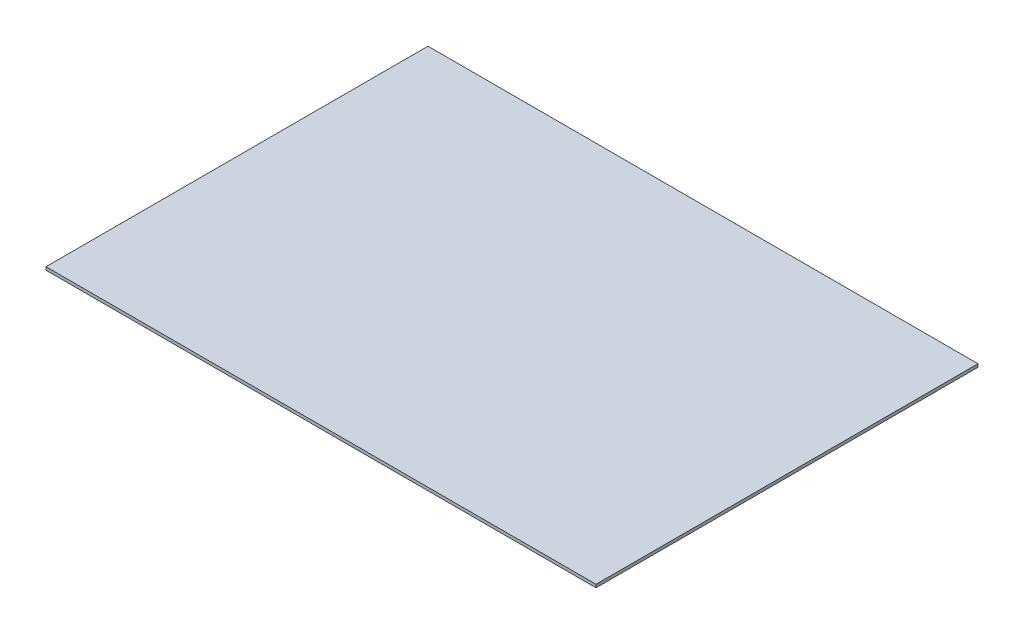
ISO-10303-21;
HEADER;
FILE_DESCRIPTION(('STEP AP214'),'2;1');
FILE_NAME('part.step','',(''),(''),'','','');
FILE_SCHEMA(('AUTOMOTIVE_DESIGN { 1 0 10303 214 1 1 1 1 }'));
ENDSEC;
DATA;
#1=APPLICATION_CONTEXT('core data for automotive mechanical design processes');
#2=APPLICATION_PROTOCOL_DEFINITION('international standard','automotive_design',2000,#1);
#3=PRODUCT_CONTEXT('',#1,'mechanical');
#4=PRODUCT('Part','Part','',(#3));
#5=PRODUCT_RELATED_PRODUCT_CATEGORY('part','',(#4));
#6=PRODUCT_DEFINITION_FORMATION('','',#4);
#7=PRODUCT_DEFINITION_CONTEXT('part definition',#1,'design');
#8=PRODUCT_DEFINITION('design','',#6,#7);
#9=PRODUCT_DEFINITION_SHAPE('','',#8);
#10=(LENGTH_UNIT() NAMED_UNIT(*) SI_UNIT(.MILLI.,.METRE.));
#11=(NAMED_UNIT(*) PLANE_ANGLE_UNIT() SI_UNIT($,.RADIAN.));
#12=(NAMED_UNIT(*) SI_UNIT($,.STERADIAN.) SOLID_ANGLE_UNIT());
#13=UNCERTAINTY_MEASURE_WITH_UNIT(LENGTH_MEASURE(1.E-05),#10,'distance_accuracy_value','');
#14=(GEOMETRIC_REPRESENTATION_CONTEXT(3) GLOBAL_UNCERTAINTY_ASSIGNED_CONTEXT((#13)) GLOBAL_UNIT_ASSIGNED_CONTEXT((#10,
#11,#12)) REPRESENTATION_CONTEXT('',''));
#15=CARTESIAN_POINT('',(0.,0.,0.));
#16=DIRECTION('',(0.,0.,1.));
#17=DIRECTION('',(1.,0.,0.));
#18=AXIS2_PLACEMENT_3D('',#15,#16,#17);
#19=CARTESIAN_POINT('',(90.,-0.5,62.5));
#20=DIRECTION('',(1.,0.,0.));
#21=DIRECTION('',(0.,0.,-1.));
#22=AXIS2_PLACEMENT_3D('',#19,#20,#21);
#23=PLANE('',#22);
#24=DIRECTION('',(0.,1.,0.));
#25=VECTOR('',#24,1.);
#26=CARTESIAN_POINT('',(90.,-0.5,-62.5));
#27=LINE('',#26,#25);
#28=CARTESIAN_POINT('',(90.,-0.5,-62.5));
#29=VERTEX_POINT('',#28);
#30=CARTESIAN_POINT('',(90.,0.5,-62.5));
#31=VERTEX_POINT('',#30);
#32=EDGE_CURVE('E52',#29,#31,#27,.T.);
#33=ORIENTED_EDGE('',*,*,#32,.T.);
#34=DIRECTION('',(0.,0.,-1.));
#35=VECTOR('',#34,1.);
#36=CARTESIAN_POINT('',(90.,0.5,62.5));
#37=LINE('',#36,#35);
#38=CARTESIAN_POINT('',(90.,0.5,62.5));
#39=VERTEX_POINT('',#38);
#40=EDGE_CURVE('E90',#39,#31,#37,.T.);
#41=ORIENTED_EDGE('',*,*,#40,.F.);
#42=DIRECTION('',(0.,1.,0.));
#43=VECTOR('',#42,1.);
#44=CARTESIAN_POINT('',(90.,-0.5,62.5));
#45=LINE('',#44,#43);
#46=CARTESIAN_POINT('',(90.,-0.5,62.5));
#47=VERTEX_POINT('',#46);
#48=EDGE_CURVE('E11',#47,#39,#45,.T.);
#49=ORIENTED_EDGE('',*,*,#48,.F.);
#50=DIRECTION('',(0.,0.,-1.));
#51=VECTOR('',#50,1.);
#52=CARTESIAN_POINT('',(90.,-0.5,62.5));
#53=LINE('',#52,#51);
#54=EDGE_CURVE('E91',#47,#29,#53,.T.);
#55=ORIENTED_EDGE('',*,*,#54,.T.);
#56=EDGE_LOOP('',(#33,#41,#49,#55));
#57=FACE_BOUND('',#56,.T.);
#58=ADVANCED_FACE('F49',(#57),#23,.T.);
#59=CARTESIAN_POINT('',(-90.,-0.5,62.5));
#60=DIRECTION('',(0.,0.,1.));
#61=DIRECTION('',(1.,0.,0.));
#62=AXIS2_PLACEMENT_3D('',#59,#60,#61);
#63=PLANE('',#62);
#64=ORIENTED_EDGE('',*,*,#48,.T.);
#65=DIRECTION('',(1.,0.,0.));
#66=VECTOR('',#65,1.);
#67=CARTESIAN_POINT('',(-90.,0.5,62.5));
#68=LINE('',#67,#66);
#69=CARTESIAN_POINT('',(-90.,0.5,62.5));
#70=VERTEX_POINT('',#69);
#71=EDGE_CURVE('E109',#70,#39,#68,.T.);
#72=ORIENTED_EDGE('',*,*,#71,.F.);
#73=DIRECTION('',(0.,1.,0.));
#74=VECTOR('',#73,1.);
#75=CARTESIAN_POINT('',(-90.,-0.5,62.5));
#76=LINE('',#75,#74);
#77=CARTESIAN_POINT('',(-90.,-0.5,62.5));
#78=VERTEX_POINT('',#77);
#79=EDGE_CURVE('E58',#78,#70,#76,.T.);
#80=ORIENTED_EDGE('',*,*,#79,.F.);
#81=DIRECTION('',(1.,0.,0.));
#82=VECTOR('',#81,1.);
#83=CARTESIAN_POINT('',(-90.,-0.5,62.5));
#84=LINE('',#83,#82);
#85=EDGE_CURVE('E97',#78,#47,#84,.T.);
#86=ORIENTED_EDGE('',*,*,#85,.T.);
#87=EDGE_LOOP('',(#64,#72,#80,#86));
#88=FACE_BOUND('',#87,.T.);
#89=ADVANCED_FACE('F133',(#88),#63,.T.);
#90=CARTESIAN_POINT('',(-90.,-0.5,62.5));
#91=DIRECTION('',(-1.,0.,0.));
#92=DIRECTION('',(0.,0.,1.));
#93=AXIS2_PLACEMENT_3D('',#90,#91,#92);
#94=PLANE('',#93);
#95=ORIENTED_EDGE('',*,*,#79,.T.);
#96=DIRECTION('',(0.,0.,1.));
#97=VECTOR('',#96,1.);
#98=CARTESIAN_POINT('',(-90.,0.5,62.5));
#99=LINE('',#98,#97);
#100=CARTESIAN_POINT('',(-90.,0.5,-62.5));
#101=VERTEX_POINT('',#100);
#102=EDGE_CURVE('E105',#101,#70,#99,.T.);
#103=ORIENTED_EDGE('',*,*,#102,.F.);
#104=DIRECTION('',(0.,1.,0.));
#105=VECTOR('',#104,1.);
#106=CARTESIAN_POINT('',(-90.,-0.5,-62.5));
#107=LINE('',#106,#105);
#108=CARTESIAN_POINT('',(-90.,-0.5,-62.5));
#109=VERTEX_POINT('',#108);
#110=EDGE_CURVE('E96',#109,#101,#107,.T.);
#111=ORIENTED_EDGE('',*,*,#110,.F.);
#112=DIRECTION('',(0.,0.,1.));
#113=VECTOR('',#112,1.);
#114=CARTESIAN_POINT('',(-90.,-0.5,62.5));
#115=LINE('',#114,#113);
#116=EDGE_CURVE('E122',#109,#78,#115,.T.);
#117=ORIENTED_EDGE('',*,*,#116,.T.);
#118=EDGE_LOOP('',(#95,#103,#111,#117));
#119=FACE_BOUND('',#118,.T.);
#120=ADVANCED_FACE('F130',(#119),#94,.T.);
#121=CARTESIAN_POINT('',(-90.,-0.5,-62.5));
#122=DIRECTION('',(0.,0.,-1.));
#123=DIRECTION('',(-1.,0.,0.));
#124=AXIS2_PLACEMENT_3D('',#121,#122,#123);
#125=PLANE('',#124);
#126=ORIENTED_EDGE('',*,*,#110,.T.);
#127=DIRECTION('',(-1.,0.,0.));
#128=VECTOR('',#127,1.);
#129=CARTESIAN_POINT('',(-90.,0.5,-62.5));
#130=LINE('',#129,#128);
#131=EDGE_CURVE('E99',#31,#101,#130,.T.);
#132=ORIENTED_EDGE('',*,*,#131,.F.);
#133=ORIENTED_EDGE('',*,*,#32,.F.);
#134=DIRECTION('',(-1.,0.,0.));
#135=VECTOR('',#134,1.);
#136=CARTESIAN_POINT('',(-90.,-0.5,-62.5));
#137=LINE('',#136,#135);
#138=EDGE_CURVE('E119',#29,#109,#137,.T.);
#139=ORIENTED_EDGE('',*,*,#138,.T.);
#140=EDGE_LOOP('',(#126,#132,#133,#139));
#141=FACE_BOUND('',#140,.T.);
#142=ADVANCED_FACE('F100',(#141),#125,.T.);
#143=CARTESIAN_POINT('',(0.,-0.5,0.));
#144=DIRECTION('',(0.,-1.,0.));
#145=DIRECTION('',(0.,0.,-1.));
#146=AXIS2_PLACEMENT_3D('',#143,#144,#145);
#147=PLANE('',#146);
#148=ORIENTED_EDGE('',*,*,#54,.F.);
#149=ORIENTED_EDGE('',*,*,#85,.F.);
#150=ORIENTED_EDGE('',*,*,#116,.F.);
#151=ORIENTED_EDGE('',*,*,#138,.F.);
#152=EDGE_LOOP('',(#148,#149,#150,#151));
#153=FACE_BOUND('',#152,.T.);
#154=ADVANCED_FACE('F135',(#153),#147,.T.);
#155=CARTESIAN_POINT('',(0.,0.5,0.));
#156=DIRECTION('',(0.,-1.,0.));
#157=DIRECTION('',(0.,0.,-1.));
#158=AXIS2_PLACEMENT_3D('',#155,#156,#157);
#159=PLANE('',#158);
#160=ORIENTED_EDGE('',*,*,#40,.T.);
#161=ORIENTED_EDGE('',*,*,#131,.T.);
#162=ORIENTED_EDGE('',*,*,#102,.T.);
#163=ORIENTED_EDGE('',*,*,#71,.T.);
#164=EDGE_LOOP('',(#160,#161,#162,#163));
#165=FACE_BOUND('',#164,.T.);
#166=ADVANCED_FACE('F108',(#165),#159,.F.);
#167=CLOSED_SHELL('',(#58,#89,#120,#142,#154,#166));
#168=MANIFOLD_SOLID_BREP('B2',#167);
#169=ADVANCED_BREP_SHAPE_REPRESENTATION('',(#18,#168),#14);
#170=SHAPE_DEFINITION_REPRESENTATION(#9,#169);
ENDSEC;
END-ISO-10303-21;
